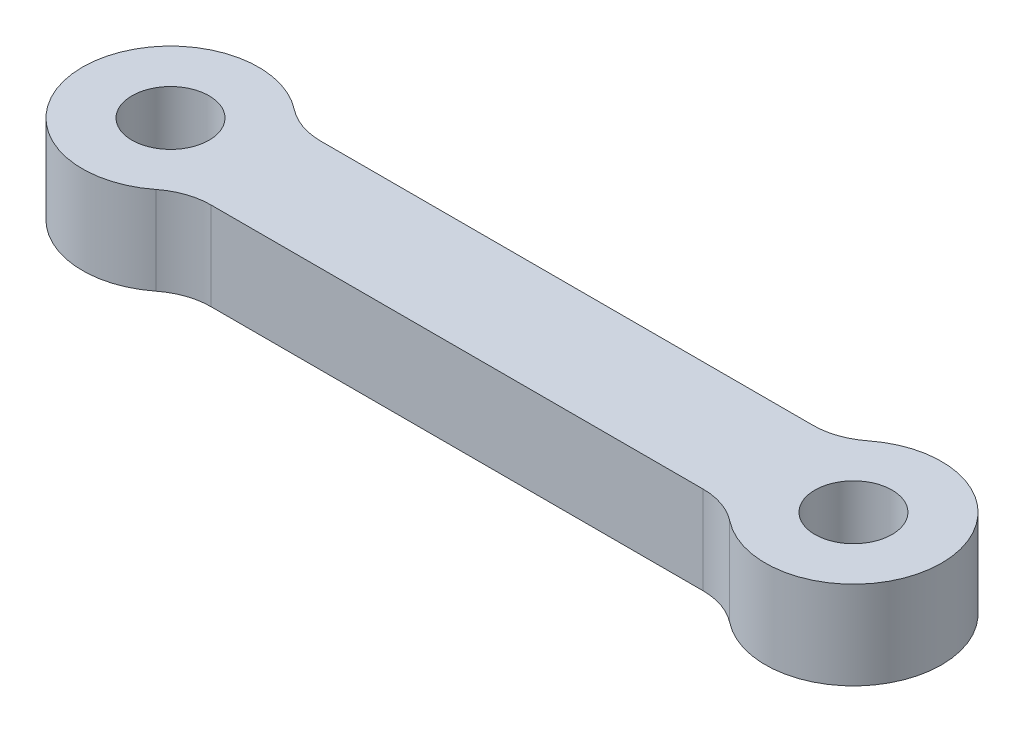
ISO-10303-21;
HEADER;
FILE_DESCRIPTION(('STEP AP214'),'2;1');
FILE_NAME('part.step','',(''),(''),'','','');
FILE_SCHEMA(('AUTOMOTIVE_DESIGN { 1 0 10303 214 1 1 1 1 }'));
ENDSEC;
DATA;
#1=APPLICATION_CONTEXT('core data for automotive mechanical design processes');
#2=APPLICATION_PROTOCOL_DEFINITION('international standard','automotive_design',2000,#1);
#3=PRODUCT_CONTEXT('',#1,'mechanical');
#4=PRODUCT('Part','Part','',(#3));
#5=PRODUCT_RELATED_PRODUCT_CATEGORY('part','',(#4));
#6=PRODUCT_DEFINITION_FORMATION('','',#4);
#7=PRODUCT_DEFINITION_CONTEXT('part definition',#1,'design');
#8=PRODUCT_DEFINITION('design','',#6,#7);
#9=PRODUCT_DEFINITION_SHAPE('','',#8);
#10=(LENGTH_UNIT() NAMED_UNIT(*) SI_UNIT(.MILLI.,.METRE.));
#11=(NAMED_UNIT(*) PLANE_ANGLE_UNIT() SI_UNIT($,.RADIAN.));
#12=(NAMED_UNIT(*) SI_UNIT($,.STERADIAN.) SOLID_ANGLE_UNIT());
#13=UNCERTAINTY_MEASURE_WITH_UNIT(LENGTH_MEASURE(1.E-05),#10,'distance_accuracy_value','');
#14=(GEOMETRIC_REPRESENTATION_CONTEXT(3) GLOBAL_UNCERTAINTY_ASSIGNED_CONTEXT((#13)) GLOBAL_UNIT_ASSIGNED_CONTEXT((#10,
#11,#12)) REPRESENTATION_CONTEXT('',''));
#15=CARTESIAN_POINT('',(0.,0.,0.));
#16=DIRECTION('',(0.,0.,1.));
#17=DIRECTION('',(1.,0.,0.));
#18=AXIS2_PLACEMENT_3D('',#15,#16,#17);
#19=CARTESIAN_POINT('',(0.,4.,0.));
#20=DIRECTION('',(0.,-1.,0.));
#21=DIRECTION('',(0.,0.,-1.));
#22=AXIS2_PLACEMENT_3D('',#19,#20,#21);
#23=CYLINDRICAL_SURFACE('',#22,4.);
#24=CARTESIAN_POINT('',(0.,4.,0.));
#25=DIRECTION('',(0.,1.,0.));
#26=DIRECTION('',(0.,0.,1.));
#27=AXIS2_PLACEMENT_3D('',#24,#25,#26);
#28=CIRCLE('',#27,4.);
#29=CARTESIAN_POINT('',(2.47435829652697,4.,-3.14285714285714));
#30=VERTEX_POINT('',#29);
#31=CARTESIAN_POINT('',(2.47435829652697,4.,3.14285714285715));
#32=VERTEX_POINT('',#31);
#33=EDGE_CURVE('E121',#30,#32,#28,.T.);
#34=ORIENTED_EDGE('',*,*,#33,.F.);
#35=DIRECTION('',(0.,-1.,0.));
#36=VECTOR('',#35,1.);
#37=CARTESIAN_POINT('',(2.47435829652697,4.,-3.14285714285714));
#38=LINE('',#37,#36);
#39=CARTESIAN_POINT('',(2.47435829652697,0.,-3.14285714285714));
#40=VERTEX_POINT('',#39);
#41=EDGE_CURVE('E107',#30,#40,#38,.T.);
#42=ORIENTED_EDGE('',*,*,#41,.T.);
#43=CARTESIAN_POINT('',(0.,0.,0.));
#44=DIRECTION('',(0.,1.,0.));
#45=DIRECTION('',(0.,0.,1.));
#46=AXIS2_PLACEMENT_3D('',#43,#44,#45);
#47=CIRCLE('',#46,4.);
#48=CARTESIAN_POINT('',(2.47435829652697,0.,3.14285714285715));
#49=VERTEX_POINT('',#48);
#50=EDGE_CURVE('E118',#40,#49,#47,.T.);
#51=ORIENTED_EDGE('',*,*,#50,.T.);
#52=DIRECTION('',(0.,-1.,0.));
#53=VECTOR('',#52,1.);
#54=CARTESIAN_POINT('',(2.47435829652697,4.,3.14285714285715));
#55=LINE('',#54,#53);
#56=EDGE_CURVE('E123',#49,#32,#55,.F.);
#57=ORIENTED_EDGE('',*,*,#56,.T.);
#58=EDGE_LOOP('',(#34,#42,#51,#57));
#59=FACE_BOUND('',#58,.T.);
#60=ADVANCED_FACE('F38',(#59),#23,.T.);
#61=CARTESIAN_POINT('',(0.,4.,2.5));
#62=DIRECTION('',(0.,0.,-1.));
#63=DIRECTION('',(-1.,0.,0.));
#64=AXIS2_PLACEMENT_3D('',#61,#62,#63);
#65=PLANE('',#64);
#66=DIRECTION('',(1.,0.,0.));
#67=VECTOR('',#66,1.);
#68=CARTESIAN_POINT('',(0.,4.,2.5));
#69=LINE('',#68,#67);
#70=CARTESIAN_POINT('',(4.33012701892219,4.,2.5));
#71=VERTEX_POINT('',#70);
#72=CARTESIAN_POINT('',(26.6698729810778,4.,2.5));
#73=VERTEX_POINT('',#72);
#74=EDGE_CURVE('E179',#71,#73,#69,.T.);
#75=ORIENTED_EDGE('',*,*,#74,.F.);
#76=DIRECTION('',(0.,1.,0.));
#77=VECTOR('',#76,1.);
#78=CARTESIAN_POINT('',(4.33012701892219,0.,2.5));
#79=LINE('',#78,#77);
#80=CARTESIAN_POINT('',(4.33012701892219,0.,2.5));
#81=VERTEX_POINT('',#80);
#82=EDGE_CURVE('E153',#71,#81,#79,.F.);
#83=ORIENTED_EDGE('',*,*,#82,.T.);
#84=DIRECTION('',(1.,0.,0.));
#85=VECTOR('',#84,1.);
#86=CARTESIAN_POINT('',(0.,0.,2.5));
#87=LINE('',#86,#85);
#88=CARTESIAN_POINT('',(26.6698729810778,0.,2.5));
#89=VERTEX_POINT('',#88);
#90=EDGE_CURVE('E129',#81,#89,#87,.T.);
#91=ORIENTED_EDGE('',*,*,#90,.T.);
#92=DIRECTION('',(0.,1.,0.));
#93=VECTOR('',#92,1.);
#94=CARTESIAN_POINT('',(26.6698729810778,4.,2.5));
#95=LINE('',#94,#93);
#96=EDGE_CURVE('E151',#89,#73,#95,.T.);
#97=ORIENTED_EDGE('',*,*,#96,.T.);
#98=EDGE_LOOP('',(#75,#83,#91,#97));
#99=FACE_BOUND('',#98,.T.);
#100=ADVANCED_FACE('F173',(#99),#65,.F.);
#101=CARTESIAN_POINT('',(31.,4.,0.));
#102=DIRECTION('',(0.,-1.,0.));
#103=DIRECTION('',(0.,0.,-1.));
#104=AXIS2_PLACEMENT_3D('',#101,#102,#103);
#105=CYLINDRICAL_SURFACE('',#104,4.00000000000001);
#106=CARTESIAN_POINT('',(31.,0.,0.));
#107=DIRECTION('',(0.,1.,0.));
#108=DIRECTION('',(0.,0.,1.));
#109=AXIS2_PLACEMENT_3D('',#106,#107,#108);
#110=CIRCLE('',#109,4.00000000000001);
#111=CARTESIAN_POINT('',(28.525641703473,0.,3.14285714285714));
#112=VERTEX_POINT('',#111);
#113=CARTESIAN_POINT('',(28.525641703473,0.,-3.14285714285714));
#114=VERTEX_POINT('',#113);
#115=EDGE_CURVE('E133',#112,#114,#110,.T.);
#116=ORIENTED_EDGE('',*,*,#115,.T.);
#117=DIRECTION('',(0.,-1.,0.));
#118=VECTOR('',#117,1.);
#119=CARTESIAN_POINT('',(28.525641703473,4.,-3.14285714285714));
#120=LINE('',#119,#118);
#121=CARTESIAN_POINT('',(28.525641703473,4.,-3.14285714285714));
#122=VERTEX_POINT('',#121);
#123=EDGE_CURVE('E53',#114,#122,#120,.F.);
#124=ORIENTED_EDGE('',*,*,#123,.T.);
#125=CARTESIAN_POINT('',(31.,4.,0.));
#126=DIRECTION('',(0.,1.,0.));
#127=DIRECTION('',(0.,0.,1.));
#128=AXIS2_PLACEMENT_3D('',#125,#126,#127);
#129=CIRCLE('',#128,4.00000000000001);
#130=CARTESIAN_POINT('',(28.525641703473,4.,3.14285714285714));
#131=VERTEX_POINT('',#130);
#132=EDGE_CURVE('E176',#131,#122,#129,.T.);
#133=ORIENTED_EDGE('',*,*,#132,.F.);
#134=DIRECTION('',(0.,-1.,0.));
#135=VECTOR('',#134,1.);
#136=CARTESIAN_POINT('',(28.525641703473,4.,3.14285714285714));
#137=LINE('',#136,#135);
#138=EDGE_CURVE('E156',#131,#112,#137,.T.);
#139=ORIENTED_EDGE('',*,*,#138,.T.);
#140=EDGE_LOOP('',(#116,#124,#133,#139));
#141=FACE_BOUND('',#140,.T.);
#142=ADVANCED_FACE('F175',(#141),#105,.T.);
#143=CARTESIAN_POINT('',(0.,4.,-2.5));
#144=DIRECTION('',(0.,0.,-1.));
#145=DIRECTION('',(-1.,0.,0.));
#146=AXIS2_PLACEMENT_3D('',#143,#144,#145);
#147=PLANE('',#146);
#148=DIRECTION('',(1.,0.,0.));
#149=VECTOR('',#148,1.);
#150=CARTESIAN_POINT('',(0.,0.,-2.5));
#151=LINE('',#150,#149);
#152=CARTESIAN_POINT('',(4.3301270189222,0.,-2.5));
#153=VERTEX_POINT('',#152);
#154=CARTESIAN_POINT('',(26.6698729810778,0.,-2.5));
#155=VERTEX_POINT('',#154);
#156=EDGE_CURVE('E140',#153,#155,#151,.T.);
#157=ORIENTED_EDGE('',*,*,#156,.F.);
#158=DIRECTION('',(0.,-1.,0.));
#159=VECTOR('',#158,1.);
#160=CARTESIAN_POINT('',(4.3301270189222,4.,-2.5));
#161=LINE('',#160,#159);
#162=CARTESIAN_POINT('',(4.3301270189222,4.,-2.5));
#163=VERTEX_POINT('',#162);
#164=EDGE_CURVE('E108',#153,#163,#161,.F.);
#165=ORIENTED_EDGE('',*,*,#164,.T.);
#166=DIRECTION('',(1.,0.,0.));
#167=VECTOR('',#166,1.);
#168=CARTESIAN_POINT('',(0.,4.,-2.5));
#169=LINE('',#168,#167);
#170=CARTESIAN_POINT('',(26.6698729810778,4.,-2.5));
#171=VERTEX_POINT('',#170);
#172=EDGE_CURVE('E178',#163,#171,#169,.T.);
#173=ORIENTED_EDGE('',*,*,#172,.T.);
#174=DIRECTION('',(0.,-1.,0.));
#175=VECTOR('',#174,1.);
#176=CARTESIAN_POINT('',(26.6698729810778,4.,-2.5));
#177=LINE('',#176,#175);
#178=EDGE_CURVE('E122',#171,#155,#177,.T.);
#179=ORIENTED_EDGE('',*,*,#178,.T.);
#180=EDGE_LOOP('',(#157,#165,#173,#179));
#181=FACE_BOUND('',#180,.T.);
#182=ADVANCED_FACE('F214',(#181),#147,.T.);
#183=CARTESIAN_POINT('',(0.,4.,0.));
#184=DIRECTION('',(0.,-1.,0.));
#185=DIRECTION('',(0.,0.,-1.));
#186=AXIS2_PLACEMENT_3D('',#183,#184,#185);
#187=CYLINDRICAL_SURFACE('',#186,1.75);
#188=CARTESIAN_POINT('',(0.,4.,0.));
#189=DIRECTION('',(0.,1.,0.));
#190=DIRECTION('',(0.,0.,1.));
#191=AXIS2_PLACEMENT_3D('',#188,#189,#190);
#192=CIRCLE('',#191,1.75);
#193=CARTESIAN_POINT('',(0.,4.,1.75));
#194=VERTEX_POINT('',#193);
#195=EDGE_CURVE('E145',#194,#194,#192,.T.);
#196=ORIENTED_EDGE('',*,*,#195,.T.);
#197=EDGE_LOOP('',(#196));
#198=FACE_BOUND('',#197,.T.);
#199=CARTESIAN_POINT('',(0.,0.,0.));
#200=DIRECTION('',(0.,1.,0.));
#201=DIRECTION('',(0.,0.,1.));
#202=AXIS2_PLACEMENT_3D('',#199,#200,#201);
#203=CIRCLE('',#202,1.75);
#204=CARTESIAN_POINT('',(0.,0.,1.75));
#205=VERTEX_POINT('',#204);
#206=EDGE_CURVE('E130',#205,#205,#203,.T.);
#207=ORIENTED_EDGE('',*,*,#206,.F.);
#208=EDGE_LOOP('',(#207));
#209=FACE_BOUND('',#208,.T.);
#210=ADVANCED_FACE('F201',(#198,#209),#187,.F.);
#211=CARTESIAN_POINT('',(31.,4.,0.));
#212=DIRECTION('',(0.,-1.,0.));
#213=DIRECTION('',(0.,0.,-1.));
#214=AXIS2_PLACEMENT_3D('',#211,#212,#213);
#215=CYLINDRICAL_SURFACE('',#214,1.75);
#216=CARTESIAN_POINT('',(31.,4.,0.));
#217=DIRECTION('',(0.,1.,0.));
#218=DIRECTION('',(0.,0.,1.));
#219=AXIS2_PLACEMENT_3D('',#216,#217,#218);
#220=CIRCLE('',#219,1.75);
#221=CARTESIAN_POINT('',(31.,4.,1.75));
#222=VERTEX_POINT('',#221);
#223=EDGE_CURVE('E146',#222,#222,#220,.T.);
#224=ORIENTED_EDGE('',*,*,#223,.T.);
#225=EDGE_LOOP('',(#224));
#226=FACE_BOUND('',#225,.T.);
#227=CARTESIAN_POINT('',(31.,0.,0.));
#228=DIRECTION('',(0.,1.,0.));
#229=DIRECTION('',(0.,0.,1.));
#230=AXIS2_PLACEMENT_3D('',#227,#228,#229);
#231=CIRCLE('',#230,1.75);
#232=CARTESIAN_POINT('',(31.,0.,1.75));
#233=VERTEX_POINT('',#232);
#234=EDGE_CURVE('E142',#233,#233,#231,.T.);
#235=ORIENTED_EDGE('',*,*,#234,.F.);
#236=EDGE_LOOP('',(#235));
#237=FACE_BOUND('',#236,.T.);
#238=ADVANCED_FACE('F188',(#226,#237),#215,.F.);
#239=CARTESIAN_POINT('',(0.,4.,0.));
#240=DIRECTION('',(0.,1.,0.));
#241=DIRECTION('',(0.,0.,1.));
#242=AXIS2_PLACEMENT_3D('',#239,#240,#241);
#243=PLANE('',#242);
#244=ORIENTED_EDGE('',*,*,#195,.F.);
#245=EDGE_LOOP('',(#244));
#246=FACE_BOUND('',#245,.T.);
#247=ORIENTED_EDGE('',*,*,#172,.F.);
#248=CARTESIAN_POINT('',(4.3301270189222,4.,-5.5));
#249=DIRECTION('',(0.,1.,0.));
#250=DIRECTION('',(0.,0.,1.));
#251=AXIS2_PLACEMENT_3D('',#248,#249,#250);
#252=CIRCLE('',#251,3.);
#253=EDGE_CURVE('E113',#163,#30,#252,.F.);
#254=ORIENTED_EDGE('',*,*,#253,.T.);
#255=ORIENTED_EDGE('',*,*,#33,.T.);
#256=CARTESIAN_POINT('',(4.33012701892219,4.,5.5));
#257=DIRECTION('',(0.,1.,0.));
#258=DIRECTION('',(0.,0.,1.));
#259=AXIS2_PLACEMENT_3D('',#256,#257,#258);
#260=CIRCLE('',#259,3.);
#261=EDGE_CURVE('E162',#32,#71,#260,.F.);
#262=ORIENTED_EDGE('',*,*,#261,.T.);
#263=ORIENTED_EDGE('',*,*,#74,.T.);
#264=CARTESIAN_POINT('',(26.6698729810778,4.,5.5));
#265=DIRECTION('',(0.,1.,0.));
#266=DIRECTION('',(0.,0.,1.));
#267=AXIS2_PLACEMENT_3D('',#264,#265,#266);
#268=CIRCLE('',#267,3.);
#269=EDGE_CURVE('E11',#73,#131,#268,.F.);
#270=ORIENTED_EDGE('',*,*,#269,.T.);
#271=ORIENTED_EDGE('',*,*,#132,.T.);
#272=CARTESIAN_POINT('',(26.6698729810778,4.,-5.5));
#273=DIRECTION('',(0.,1.,0.));
#274=DIRECTION('',(0.,0.,1.));
#275=AXIS2_PLACEMENT_3D('',#272,#273,#274);
#276=CIRCLE('',#275,3.);
#277=EDGE_CURVE('E166',#122,#171,#276,.F.);
#278=ORIENTED_EDGE('',*,*,#277,.T.);
#279=EDGE_LOOP('',(#247,#254,#255,#262,#263,#270,#271,#278));
#280=FACE_BOUND('',#279,.T.);
#281=ORIENTED_EDGE('',*,*,#223,.F.);
#282=EDGE_LOOP('',(#281));
#283=FACE_BOUND('',#282,.T.);
#284=ADVANCED_FACE('F191',(#246,#280,#283),#243,.T.);
#285=CARTESIAN_POINT('',(0.,0.,0.));
#286=DIRECTION('',(0.,1.,0.));
#287=DIRECTION('',(0.,0.,1.));
#288=AXIS2_PLACEMENT_3D('',#285,#286,#287);
#289=PLANE('',#288);
#290=ORIENTED_EDGE('',*,*,#206,.T.);
#291=EDGE_LOOP('',(#290));
#292=FACE_BOUND('',#291,.T.);
#293=ORIENTED_EDGE('',*,*,#50,.F.);
#294=CARTESIAN_POINT('',(4.3301270189222,0.,-5.5));
#295=DIRECTION('',(0.,1.,0.));
#296=DIRECTION('',(0.,0.,1.));
#297=AXIS2_PLACEMENT_3D('',#294,#295,#296);
#298=CIRCLE('',#297,3.);
#299=EDGE_CURVE('E103',#40,#153,#298,.T.);
#300=ORIENTED_EDGE('',*,*,#299,.T.);
#301=ORIENTED_EDGE('',*,*,#156,.T.);
#302=CARTESIAN_POINT('',(26.6698729810778,0.,-5.5));
#303=DIRECTION('',(0.,1.,0.));
#304=DIRECTION('',(0.,0.,1.));
#305=AXIS2_PLACEMENT_3D('',#302,#303,#304);
#306=CIRCLE('',#305,3.);
#307=EDGE_CURVE('E164',#155,#114,#306,.T.);
#308=ORIENTED_EDGE('',*,*,#307,.T.);
#309=ORIENTED_EDGE('',*,*,#115,.F.);
#310=CARTESIAN_POINT('',(26.6698729810778,0.,5.5));
#311=DIRECTION('',(0.,1.,0.));
#312=DIRECTION('',(0.,0.,1.));
#313=AXIS2_PLACEMENT_3D('',#310,#311,#312);
#314=CIRCLE('',#313,3.);
#315=EDGE_CURVE('E46',#112,#89,#314,.T.);
#316=ORIENTED_EDGE('',*,*,#315,.T.);
#317=ORIENTED_EDGE('',*,*,#90,.F.);
#318=CARTESIAN_POINT('',(4.33012701892219,0.,5.5));
#319=DIRECTION('',(0.,1.,0.));
#320=DIRECTION('',(0.,0.,1.));
#321=AXIS2_PLACEMENT_3D('',#318,#319,#320);
#322=CIRCLE('',#321,3.);
#323=EDGE_CURVE('E128',#81,#49,#322,.T.);
#324=ORIENTED_EDGE('',*,*,#323,.T.);
#325=EDGE_LOOP('',(#293,#300,#301,#308,#309,#316,#317,#324));
#326=FACE_BOUND('',#325,.T.);
#327=ORIENTED_EDGE('',*,*,#234,.T.);
#328=EDGE_LOOP('',(#327));
#329=FACE_BOUND('',#328,.T.);
#330=ADVANCED_FACE('F125',(#292,#326,#329),#289,.F.);
#331=CARTESIAN_POINT('',(4.3301270189222,4.,-5.5));
#332=DIRECTION('',(0.,-1.,0.));
#333=DIRECTION('',(0.,0.,-1.));
#334=AXIS2_PLACEMENT_3D('',#331,#332,#333);
#335=CYLINDRICAL_SURFACE('',#334,3.);
#336=ORIENTED_EDGE('',*,*,#253,.F.);
#337=ORIENTED_EDGE('',*,*,#164,.F.);
#338=ORIENTED_EDGE('',*,*,#299,.F.);
#339=ORIENTED_EDGE('',*,*,#41,.F.);
#340=EDGE_LOOP('',(#336,#337,#338,#339));
#341=FACE_BOUND('',#340,.T.);
#342=ADVANCED_FACE('F106',(#341),#335,.F.);
#343=CARTESIAN_POINT('',(4.33012701892219,4.,5.5));
#344=DIRECTION('',(0.,-1.,0.));
#345=DIRECTION('',(0.,0.,-1.));
#346=AXIS2_PLACEMENT_3D('',#343,#344,#345);
#347=CYLINDRICAL_SURFACE('',#346,3.);
#348=ORIENTED_EDGE('',*,*,#261,.F.);
#349=ORIENTED_EDGE('',*,*,#56,.F.);
#350=ORIENTED_EDGE('',*,*,#323,.F.);
#351=ORIENTED_EDGE('',*,*,#82,.F.);
#352=EDGE_LOOP('',(#348,#349,#350,#351));
#353=FACE_BOUND('',#352,.T.);
#354=ADVANCED_FACE('F218',(#353),#347,.F.);
#355=CARTESIAN_POINT('',(26.6698729810778,4.,-5.5));
#356=DIRECTION('',(0.,-1.,0.));
#357=DIRECTION('',(0.,0.,-1.));
#358=AXIS2_PLACEMENT_3D('',#355,#356,#357);
#359=CYLINDRICAL_SURFACE('',#358,3.);
#360=ORIENTED_EDGE('',*,*,#277,.F.);
#361=ORIENTED_EDGE('',*,*,#123,.F.);
#362=ORIENTED_EDGE('',*,*,#307,.F.);
#363=ORIENTED_EDGE('',*,*,#178,.F.);
#364=EDGE_LOOP('',(#360,#361,#362,#363));
#365=FACE_BOUND('',#364,.T.);
#366=ADVANCED_FACE('F220',(#365),#359,.F.);
#367=CARTESIAN_POINT('',(26.6698729810778,4.,5.5));
#368=DIRECTION('',(0.,-1.,0.));
#369=DIRECTION('',(0.,0.,-1.));
#370=AXIS2_PLACEMENT_3D('',#367,#368,#369);
#371=CYLINDRICAL_SURFACE('',#370,3.);
#372=ORIENTED_EDGE('',*,*,#269,.F.);
#373=ORIENTED_EDGE('',*,*,#96,.F.);
#374=ORIENTED_EDGE('',*,*,#315,.F.);
#375=ORIENTED_EDGE('',*,*,#138,.F.);
#376=EDGE_LOOP('',(#372,#373,#374,#375));
#377=FACE_BOUND('',#376,.T.);
#378=ADVANCED_FACE('F40',(#377),#371,.F.);
#379=CLOSED_SHELL('',(#60,#100,#142,#182,#210,#238,#284,#330,#342,#354,#366,#378));
#380=MANIFOLD_SOLID_BREP('B2',#379);
#381=ADVANCED_BREP_SHAPE_REPRESENTATION('',(#18,#380),#14);
#382=SHAPE_DEFINITION_REPRESENTATION(#9,#381);
ENDSEC;
END-ISO-10303-21;
